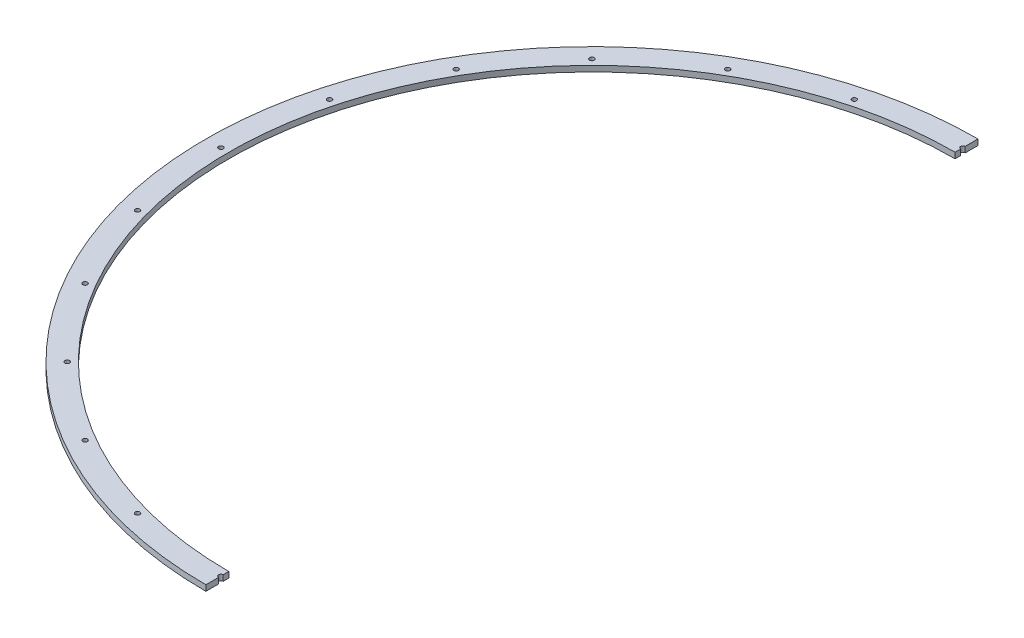
ISO-10303-21;
HEADER;
FILE_DESCRIPTION(('STEP AP214'),'2;1');
FILE_NAME('part.step','',(''),(''),'','','');
FILE_SCHEMA(('AUTOMOTIVE_DESIGN { 1 0 10303 214 1 1 1 1 }'));
ENDSEC;
DATA;
#1=APPLICATION_CONTEXT('core data for automotive mechanical design processes');
#2=APPLICATION_PROTOCOL_DEFINITION('international standard','automotive_design',2000,#1);
#3=PRODUCT_CONTEXT('',#1,'mechanical');
#4=PRODUCT('Part','Part','',(#3));
#5=PRODUCT_RELATED_PRODUCT_CATEGORY('part','',(#4));
#6=PRODUCT_DEFINITION_FORMATION('','',#4);
#7=PRODUCT_DEFINITION_CONTEXT('part definition',#1,'design');
#8=PRODUCT_DEFINITION('design','',#6,#7);
#9=PRODUCT_DEFINITION_SHAPE('','',#8);
#10=(LENGTH_UNIT() NAMED_UNIT(*) SI_UNIT(.MILLI.,.METRE.));
#11=(NAMED_UNIT(*) PLANE_ANGLE_UNIT() SI_UNIT($,.RADIAN.));
#12=(NAMED_UNIT(*) SI_UNIT($,.STERADIAN.) SOLID_ANGLE_UNIT());
#13=UNCERTAINTY_MEASURE_WITH_UNIT(LENGTH_MEASURE(1.E-05),#10,'distance_accuracy_value','');
#14=(GEOMETRIC_REPRESENTATION_CONTEXT(3) GLOBAL_UNCERTAINTY_ASSIGNED_CONTEXT((#13)) GLOBAL_UNIT_ASSIGNED_CONTEXT((#10,
#11,#12)) REPRESENTATION_CONTEXT('',''));
#15=CARTESIAN_POINT('',(0.,0.,0.));
#16=DIRECTION('',(0.,0.,1.));
#17=DIRECTION('',(1.,0.,0.));
#18=AXIS2_PLACEMENT_3D('',#15,#16,#17);
#19=CARTESIAN_POINT('',(0.,209.55,-401.955));
#20=DIRECTION('',(-1.,0.,0.));
#21=DIRECTION('',(0.,0.,1.));
#22=AXIS2_PLACEMENT_3D('',#19,#20,#21);
#23=PLANE('',#22);
#24=DIRECTION('',(0.,-1.,0.));
#25=VECTOR('',#24,1.);
#26=CARTESIAN_POINT('',(0.,209.55,-413.22625));
#27=LINE('',#26,#25);
#28=CARTESIAN_POINT('',(0.,203.2,-413.22625));
#29=VERTEX_POINT('',#28);
#30=CARTESIAN_POINT('',(0.,209.55,-413.22625));
#31=VERTEX_POINT('',#30);
#32=EDGE_CURVE('E100',#29,#31,#27,.F.);
#33=ORIENTED_EDGE('',*,*,#32,.F.);
#34=DIRECTION('',(0.,0.,-1.));
#35=VECTOR('',#34,1.);
#36=CARTESIAN_POINT('',(0.,203.2,-401.955));
#37=LINE('',#36,#35);
#38=CARTESIAN_POINT('',(0.,203.2,-427.355));
#39=VERTEX_POINT('',#38);
#40=EDGE_CURVE('E138',#29,#39,#37,.T.);
#41=ORIENTED_EDGE('',*,*,#40,.T.);
#42=DIRECTION('',(0.,-1.,0.));
#43=VECTOR('',#42,1.);
#44=CARTESIAN_POINT('',(0.,209.55,-427.355));
#45=LINE('',#44,#43);
#46=CARTESIAN_POINT('',(0.,209.55,-427.355));
#47=VERTEX_POINT('',#46);
#48=EDGE_CURVE('E120',#47,#39,#45,.T.);
#49=ORIENTED_EDGE('',*,*,#48,.F.);
#50=DIRECTION('',(0.,0.,-1.));
#51=VECTOR('',#50,1.);
#52=CARTESIAN_POINT('',(0.,209.55,-401.955));
#53=LINE('',#52,#51);
#54=EDGE_CURVE('E113',#31,#47,#53,.T.);
#55=ORIENTED_EDGE('',*,*,#54,.F.);
#56=EDGE_LOOP('',(#33,#41,#49,#55));
#57=FACE_BOUND('',#56,.T.);
#58=ADVANCED_FACE('F36',(#57),#23,.F.);
#59=DIRECTION('',(0.,-1.,0.));
#60=VECTOR('',#59,1.);
#61=CARTESIAN_POINT('',(0.,209.55,-408.14625));
#62=LINE('',#61,#60);
#63=CARTESIAN_POINT('',(0.,209.55,-408.14625));
#64=VERTEX_POINT('',#63);
#65=CARTESIAN_POINT('',(0.,203.2,-408.14625));
#66=VERTEX_POINT('',#65);
#67=EDGE_CURVE('E52',#64,#66,#62,.T.);
#68=ORIENTED_EDGE('',*,*,#67,.F.);
#69=CARTESIAN_POINT('',(0.,209.55,-401.955));
#70=VERTEX_POINT('',#69);
#71=EDGE_CURVE('E116',#70,#64,#53,.T.);
#72=ORIENTED_EDGE('',*,*,#71,.F.);
#73=DIRECTION('',(0.,-1.,0.));
#74=VECTOR('',#73,1.);
#75=CARTESIAN_POINT('',(0.,209.55,-401.955));
#76=LINE('',#75,#74);
#77=CARTESIAN_POINT('',(0.,203.2,-401.955));
#78=VERTEX_POINT('',#77);
#79=EDGE_CURVE('E144',#70,#78,#76,.T.);
#80=ORIENTED_EDGE('',*,*,#79,.T.);
#81=EDGE_CURVE('E139',#78,#66,#37,.T.);
#82=ORIENTED_EDGE('',*,*,#81,.T.);
#83=EDGE_LOOP('',(#68,#72,#80,#82));
#84=FACE_BOUND('',#83,.T.);
#85=ADVANCED_FACE('F213',(#84),#23,.F.);
#86=CARTESIAN_POINT('',(0.,209.55,427.355));
#87=DIRECTION('',(-1.,0.,0.));
#88=DIRECTION('',(0.,0.,1.));
#89=AXIS2_PLACEMENT_3D('',#86,#87,#88);
#90=PLANE('',#89);
#91=DIRECTION('',(0.,-1.,0.));
#92=VECTOR('',#91,1.);
#93=CARTESIAN_POINT('',(0.,209.55,408.14625));
#94=LINE('',#93,#92);
#95=CARTESIAN_POINT('',(0.,203.2,408.14625));
#96=VERTEX_POINT('',#95);
#97=CARTESIAN_POINT('',(0.,209.55,408.14625));
#98=VERTEX_POINT('',#97);
#99=EDGE_CURVE('E132',#96,#98,#94,.F.);
#100=ORIENTED_EDGE('',*,*,#99,.F.);
#101=DIRECTION('',(0.,0.,-1.));
#102=VECTOR('',#101,1.);
#103=CARTESIAN_POINT('',(0.,203.2,427.355));
#104=LINE('',#103,#102);
#105=CARTESIAN_POINT('',(0.,203.2,401.955));
#106=VERTEX_POINT('',#105);
#107=EDGE_CURVE('E131',#96,#106,#104,.T.);
#108=ORIENTED_EDGE('',*,*,#107,.T.);
#109=DIRECTION('',(0.,-1.,0.));
#110=VECTOR('',#109,1.);
#111=CARTESIAN_POINT('',(0.,209.55,401.955));
#112=LINE('',#111,#110);
#113=CARTESIAN_POINT('',(0.,209.55,401.955));
#114=VERTEX_POINT('',#113);
#115=EDGE_CURVE('E147',#114,#106,#112,.T.);
#116=ORIENTED_EDGE('',*,*,#115,.F.);
#117=DIRECTION('',(0.,0.,-1.));
#118=VECTOR('',#117,1.);
#119=CARTESIAN_POINT('',(0.,209.55,427.355));
#120=LINE('',#119,#118);
#121=EDGE_CURVE('E197',#98,#114,#120,.T.);
#122=ORIENTED_EDGE('',*,*,#121,.F.);
#123=EDGE_LOOP('',(#100,#108,#116,#122));
#124=FACE_BOUND('',#123,.T.);
#125=ADVANCED_FACE('F206',(#124),#90,.F.);
#126=DIRECTION('',(0.,-1.,0.));
#127=VECTOR('',#126,1.);
#128=CARTESIAN_POINT('',(0.,209.55,413.22625));
#129=LINE('',#128,#127);
#130=CARTESIAN_POINT('',(0.,209.55,413.22625));
#131=VERTEX_POINT('',#130);
#132=CARTESIAN_POINT('',(0.,203.2,413.22625));
#133=VERTEX_POINT('',#132);
#134=EDGE_CURVE('E60',#131,#133,#129,.T.);
#135=ORIENTED_EDGE('',*,*,#134,.F.);
#136=CARTESIAN_POINT('',(0.,209.55,427.355));
#137=VERTEX_POINT('',#136);
#138=EDGE_CURVE('E124',#137,#131,#120,.T.);
#139=ORIENTED_EDGE('',*,*,#138,.F.);
#140=DIRECTION('',(0.,-1.,0.));
#141=VECTOR('',#140,1.);
#142=CARTESIAN_POINT('',(0.,209.55,427.355));
#143=LINE('',#142,#141);
#144=CARTESIAN_POINT('',(0.,203.2,427.355));
#145=VERTEX_POINT('',#144);
#146=EDGE_CURVE('E150',#137,#145,#143,.T.);
#147=ORIENTED_EDGE('',*,*,#146,.T.);
#148=EDGE_CURVE('E133',#145,#133,#104,.T.);
#149=ORIENTED_EDGE('',*,*,#148,.T.);
#150=EDGE_LOOP('',(#135,#139,#147,#149));
#151=FACE_BOUND('',#150,.T.);
#152=ADVANCED_FACE('F301',(#151),#90,.F.);
#153=CARTESIAN_POINT('',(0.,209.55,0.));
#154=DIRECTION('',(0.,-1.,0.));
#155=DIRECTION('',(0.,0.,-1.));
#156=AXIS2_PLACEMENT_3D('',#153,#154,#155);
#157=CYLINDRICAL_SURFACE('',#156,427.355);
#158=CARTESIAN_POINT('',(0.,203.2,0.));
#159=DIRECTION('',(0.,1.,0.));
#160=DIRECTION('',(0.,0.,1.));
#161=AXIS2_PLACEMENT_3D('',#158,#159,#160);
#162=CIRCLE('',#161,427.355);
#163=EDGE_CURVE('E128',#39,#145,#162,.T.);
#164=ORIENTED_EDGE('',*,*,#163,.T.);
#165=ORIENTED_EDGE('',*,*,#146,.F.);
#166=CARTESIAN_POINT('',(0.,209.55,0.));
#167=DIRECTION('',(0.,1.,0.));
#168=DIRECTION('',(0.,0.,1.));
#169=AXIS2_PLACEMENT_3D('',#166,#167,#168);
#170=CIRCLE('',#169,427.355);
#171=EDGE_CURVE('E142',#47,#137,#170,.T.);
#172=ORIENTED_EDGE('',*,*,#171,.F.);
#173=ORIENTED_EDGE('',*,*,#48,.T.);
#174=EDGE_LOOP('',(#164,#165,#172,#173));
#175=FACE_BOUND('',#174,.T.);
#176=ADVANCED_FACE('F38',(#175),#157,.T.);
#177=CARTESIAN_POINT('',(0.,209.55,0.));
#178=DIRECTION('',(0.,-1.,0.));
#179=DIRECTION('',(0.,0.,-1.));
#180=AXIS2_PLACEMENT_3D('',#177,#178,#179);
#181=CYLINDRICAL_SURFACE('',#180,401.955);
#182=CARTESIAN_POINT('',(0.,203.2,0.));
#183=DIRECTION('',(0.,-1.,0.));
#184=DIRECTION('',(0.,0.,1.));
#185=AXIS2_PLACEMENT_3D('',#182,#183,#184);
#186=CIRCLE('',#185,401.955);
#187=EDGE_CURVE('E136',#106,#78,#186,.T.);
#188=ORIENTED_EDGE('',*,*,#187,.T.);
#189=ORIENTED_EDGE('',*,*,#79,.F.);
#190=CARTESIAN_POINT('',(0.,209.55,0.));
#191=DIRECTION('',(0.,-1.,0.));
#192=DIRECTION('',(0.,0.,1.));
#193=AXIS2_PLACEMENT_3D('',#190,#191,#192);
#194=CIRCLE('',#193,401.955);
#195=EDGE_CURVE('E122',#114,#70,#194,.T.);
#196=ORIENTED_EDGE('',*,*,#195,.F.);
#197=ORIENTED_EDGE('',*,*,#115,.T.);
#198=EDGE_LOOP('',(#188,#189,#196,#197));
#199=FACE_BOUND('',#198,.T.);
#200=ADVANCED_FACE('F210',(#199),#181,.F.);
#201=CARTESIAN_POINT('',(0.,209.55,0.));
#202=DIRECTION('',(0.,1.,0.));
#203=DIRECTION('',(0.,0.,1.));
#204=AXIS2_PLACEMENT_3D('',#201,#202,#203);
#205=PLANE('',#204);
#206=CARTESIAN_POINT('',(-205.343125,209.55,355.664725484967));
#207=DIRECTION('',(0.,1.,0.));
#208=DIRECTION('',(-0.500000000000001,0.,0.866025403784438));
#209=AXIS2_PLACEMENT_3D('',#206,#207,#208);
#210=CIRCLE('',#209,2.54000000000001);
#211=CARTESIAN_POINT('',(-206.613125,209.55,357.864430010579));
#212=VERTEX_POINT('',#211);
#213=EDGE_CURVE('E214',#212,#212,#210,.T.);
#214=ORIENTED_EDGE('',*,*,#213,.F.);
#215=EDGE_LOOP('',(#214));
#216=FACE_BOUND('',#215,.T.);
#217=CARTESIAN_POINT('',(-290.399032315074,209.55,290.399032315073));
#218=DIRECTION('',(0.,1.,0.));
#219=DIRECTION('',(-0.707106781186549,0.,0.707106781186546));
#220=AXIS2_PLACEMENT_3D('',#217,#218,#219);
#221=CIRCLE('',#220,2.54000000000001);
#222=CARTESIAN_POINT('',(-292.195083539288,209.55,292.195083539287));
#223=VERTEX_POINT('',#222);
#224=EDGE_CURVE('E216',#223,#223,#221,.T.);
#225=ORIENTED_EDGE('',*,*,#224,.F.);
#226=EDGE_LOOP('',(#225));
#227=FACE_BOUND('',#226,.T.);
#228=CARTESIAN_POINT('',(-355.664725484967,209.55,205.343124999999));
#229=DIRECTION('',(0.,1.,0.));
#230=DIRECTION('',(-0.86602540378444,0.,0.499999999999998));
#231=AXIS2_PLACEMENT_3D('',#228,#229,#230);
#232=CIRCLE('',#231,2.54000000000001);
#233=CARTESIAN_POINT('',(-357.86443001058,209.55,206.613124999999));
#234=VERTEX_POINT('',#233);
#235=EDGE_CURVE('E239',#234,#234,#232,.T.);
#236=ORIENTED_EDGE('',*,*,#235,.F.);
#237=EDGE_LOOP('',(#236));
#238=FACE_BOUND('',#237,.T.);
#239=CARTESIAN_POINT('',(-396.692455376809,209.55,106.293423061734));
#240=DIRECTION('',(0.,1.,0.));
#241=DIRECTION('',(-0.965925826289069,0.,0.258819045102518));
#242=AXIS2_PLACEMENT_3D('',#239,#240,#241);
#243=CIRCLE('',#242,2.54000000000001);
#244=CARTESIAN_POINT('',(-399.145906975583,209.55,106.950823436294));
#245=VERTEX_POINT('',#244);
#246=EDGE_CURVE('E236',#245,#245,#243,.T.);
#247=ORIENTED_EDGE('',*,*,#246,.F.);
#248=EDGE_LOOP('',(#247));
#249=FACE_BOUND('',#248,.T.);
#250=CARTESIAN_POINT('',(-410.68625,209.55,-1.32299483267052E-12));
#251=DIRECTION('',(0.,1.,0.));
#252=DIRECTION('',(-1.,0.,0.));
#253=AXIS2_PLACEMENT_3D('',#250,#251,#252);
#254=CIRCLE('',#253,2.54000000000001);
#255=CARTESIAN_POINT('',(-413.22625,209.55,-1.33186319527119E-12));
#256=VERTEX_POINT('',#255);
#257=EDGE_CURVE('E233',#256,#256,#254,.T.);
#258=ORIENTED_EDGE('',*,*,#257,.F.);
#259=EDGE_LOOP('',(#258));
#260=FACE_BOUND('',#259,.T.);
#261=CARTESIAN_POINT('',(-396.692455376808,209.55,-106.293423061737));
#262=DIRECTION('',(0.,1.,0.));
#263=DIRECTION('',(-0.965925826289067,0.,-0.258819045102525));
#264=AXIS2_PLACEMENT_3D('',#261,#262,#263);
#265=CIRCLE('',#264,2.54000000000001);
#266=CARTESIAN_POINT('',(-399.145906975583,209.55,-106.950823436297));
#267=VERTEX_POINT('',#266);
#268=EDGE_CURVE('E230',#267,#267,#265,.T.);
#269=ORIENTED_EDGE('',*,*,#268,.F.);
#270=EDGE_LOOP('',(#269));
#271=FACE_BOUND('',#270,.T.);
#272=CARTESIAN_POINT('',(-355.664725484966,209.55,-205.343125000002));
#273=DIRECTION('',(0.,1.,0.));
#274=DIRECTION('',(-0.866025403784436,0.,-0.500000000000004));
#275=AXIS2_PLACEMENT_3D('',#272,#273,#274);
#276=CIRCLE('',#275,2.54000000000001);
#277=CARTESIAN_POINT('',(-357.864430010578,209.55,-206.613125000002));
#278=VERTEX_POINT('',#277);
#279=EDGE_CURVE('E227',#278,#278,#276,.T.);
#280=ORIENTED_EDGE('',*,*,#279,.F.);
#281=EDGE_LOOP('',(#280));
#282=FACE_BOUND('',#281,.T.);
#283=CARTESIAN_POINT('',(-290.399032315072,209.55,-290.399032315075));
#284=DIRECTION('',(0.,1.,0.));
#285=DIRECTION('',(-0.707106781186544,0.,-0.707106781186551));
#286=AXIS2_PLACEMENT_3D('',#283,#284,#285);
#287=CIRCLE('',#286,2.54000000000001);
#288=CARTESIAN_POINT('',(-292.195083539286,209.55,-292.195083539289));
#289=VERTEX_POINT('',#288);
#290=EDGE_CURVE('E224',#289,#289,#287,.T.);
#291=ORIENTED_EDGE('',*,*,#290,.F.);
#292=EDGE_LOOP('',(#291));
#293=FACE_BOUND('',#292,.T.);
#294=CARTESIAN_POINT('',(-205.343124999998,209.55,-355.664725484968));
#295=DIRECTION('',(0.,1.,0.));
#296=DIRECTION('',(-0.499999999999995,0.,-0.866025403784442));
#297=AXIS2_PLACEMENT_3D('',#294,#295,#296);
#298=CIRCLE('',#297,2.54000000000001);
#299=CARTESIAN_POINT('',(-206.613124999998,209.55,-357.86443001058));
#300=VERTEX_POINT('',#299);
#301=EDGE_CURVE('E221',#300,#300,#298,.T.);
#302=ORIENTED_EDGE('',*,*,#301,.F.);
#303=EDGE_LOOP('',(#302));
#304=FACE_BOUND('',#303,.T.);
#305=CARTESIAN_POINT('',(-106.293423061733,209.55,-396.692455376809));
#306=DIRECTION('',(0.,1.,0.));
#307=DIRECTION('',(-0.258819045102515,0.,-0.96592582628907));
#308=AXIS2_PLACEMENT_3D('',#305,#306,#307);
#309=CIRCLE('',#308,2.54000000000001);
#310=CARTESIAN_POINT('',(-106.950823436293,209.55,-399.145906975584));
#311=VERTEX_POINT('',#310);
#312=EDGE_CURVE('E117',#311,#311,#309,.T.);
#313=ORIENTED_EDGE('',*,*,#312,.F.);
#314=EDGE_LOOP('',(#313));
#315=FACE_BOUND('',#314,.T.);
#316=CARTESIAN_POINT('',(-106.293423061735,209.55,396.692455376809));
#317=DIRECTION('',(0.,1.,0.));
#318=DIRECTION('',(-0.258819045102521,0.,0.965925826289068));
#319=AXIS2_PLACEMENT_3D('',#316,#317,#318);
#320=CIRCLE('',#319,2.54000000000001);
#321=CARTESIAN_POINT('',(-106.950823436296,209.55,399.145906975583));
#322=VERTEX_POINT('',#321);
#323=EDGE_CURVE('E157',#322,#322,#320,.T.);
#324=ORIENTED_EDGE('',*,*,#323,.F.);
#325=EDGE_LOOP('',(#324));
#326=FACE_BOUND('',#325,.T.);
#327=ORIENTED_EDGE('',*,*,#71,.T.);
#328=CARTESIAN_POINT('',(-1.10908545323941E-13,209.55,-410.68625));
#329=DIRECTION('',(0.,1.,0.));
#330=DIRECTION('',(0.,0.,-1.));
#331=AXIS2_PLACEMENT_3D('',#328,#329,#330);
#332=CIRCLE('',#331,2.54000000000001);
#333=EDGE_CURVE('E103',#31,#64,#332,.T.);
#334=ORIENTED_EDGE('',*,*,#333,.F.);
#335=ORIENTED_EDGE('',*,*,#54,.T.);
#336=ORIENTED_EDGE('',*,*,#171,.T.);
#337=ORIENTED_EDGE('',*,*,#138,.T.);
#338=CARTESIAN_POINT('',(1.10908545323941E-13,209.55,410.68625));
#339=DIRECTION('',(0.,1.,0.));
#340=DIRECTION('',(0.,0.,1.));
#341=AXIS2_PLACEMENT_3D('',#338,#339,#340);
#342=CIRCLE('',#341,2.54000000000001);
#343=EDGE_CURVE('E156',#98,#131,#342,.T.);
#344=ORIENTED_EDGE('',*,*,#343,.F.);
#345=ORIENTED_EDGE('',*,*,#121,.T.);
#346=ORIENTED_EDGE('',*,*,#195,.T.);
#347=EDGE_LOOP('',(#327,#334,#335,#336,#337,#344,#345,#346));
#348=FACE_BOUND('',#347,.T.);
#349=ADVANCED_FACE('F111',(#216,#227,#238,#249,#260,#271,#282,#293,#304,#315,#326,#348),#205,.T.);
#350=CARTESIAN_POINT('',(0.,203.2,0.));
#351=DIRECTION('',(0.,1.,0.));
#352=DIRECTION('',(0.,0.,1.));
#353=AXIS2_PLACEMENT_3D('',#350,#351,#352);
#354=PLANE('',#353);
#355=CARTESIAN_POINT('',(-205.343125,203.2,355.664725484967));
#356=DIRECTION('',(0.,1.,0.));
#357=DIRECTION('',(0.,0.,1.));
#358=AXIS2_PLACEMENT_3D('',#355,#356,#357);
#359=CIRCLE('',#358,2.54000000000001);
#360=CARTESIAN_POINT('',(-205.343125,203.2,358.204725484967));
#361=VERTEX_POINT('',#360);
#362=EDGE_CURVE('E40',#361,#361,#359,.F.);
#363=ORIENTED_EDGE('',*,*,#362,.F.);
#364=EDGE_LOOP('',(#363));
#365=FACE_BOUND('',#364,.T.);
#366=CARTESIAN_POINT('',(-290.399032315074,203.2,290.399032315073));
#367=DIRECTION('',(0.,1.,0.));
#368=DIRECTION('',(0.,0.,1.));
#369=AXIS2_PLACEMENT_3D('',#366,#367,#368);
#370=CIRCLE('',#369,2.54000000000001);
#371=CARTESIAN_POINT('',(-290.399032315074,203.2,292.939032315073));
#372=VERTEX_POINT('',#371);
#373=EDGE_CURVE('E181',#372,#372,#370,.F.);
#374=ORIENTED_EDGE('',*,*,#373,.F.);
#375=EDGE_LOOP('',(#374));
#376=FACE_BOUND('',#375,.T.);
#377=CARTESIAN_POINT('',(-355.664725484967,203.2,205.343124999999));
#378=DIRECTION('',(0.,1.,0.));
#379=DIRECTION('',(0.,0.,1.));
#380=AXIS2_PLACEMENT_3D('',#377,#378,#379);
#381=CIRCLE('',#380,2.54000000000001);
#382=CARTESIAN_POINT('',(-355.664725484967,203.2,207.883124999999));
#383=VERTEX_POINT('',#382);
#384=EDGE_CURVE('E179',#383,#383,#381,.F.);
#385=ORIENTED_EDGE('',*,*,#384,.F.);
#386=EDGE_LOOP('',(#385));
#387=FACE_BOUND('',#386,.T.);
#388=CARTESIAN_POINT('',(-396.692455376809,203.2,106.293423061734));
#389=DIRECTION('',(0.,1.,0.));
#390=DIRECTION('',(0.,0.,1.));
#391=AXIS2_PLACEMENT_3D('',#388,#389,#390);
#392=CIRCLE('',#391,2.54000000000001);
#393=CARTESIAN_POINT('',(-396.692455376809,203.2,108.833423061734));
#394=VERTEX_POINT('',#393);
#395=EDGE_CURVE('E176',#394,#394,#392,.F.);
#396=ORIENTED_EDGE('',*,*,#395,.F.);
#397=EDGE_LOOP('',(#396));
#398=FACE_BOUND('',#397,.T.);
#399=CARTESIAN_POINT('',(-410.68625,203.2,-1.32299483267052E-12));
#400=DIRECTION('',(0.,1.,0.));
#401=DIRECTION('',(0.,0.,1.));
#402=AXIS2_PLACEMENT_3D('',#399,#400,#401);
#403=CIRCLE('',#402,2.54000000000001);
#404=CARTESIAN_POINT('',(-410.68625,203.2,2.53999999999868));
#405=VERTEX_POINT('',#404);
#406=EDGE_CURVE('E173',#405,#405,#403,.F.);
#407=ORIENTED_EDGE('',*,*,#406,.F.);
#408=EDGE_LOOP('',(#407));
#409=FACE_BOUND('',#408,.T.);
#410=CARTESIAN_POINT('',(-396.692455376808,203.2,-106.293423061737));
#411=DIRECTION('',(0.,1.,0.));
#412=DIRECTION('',(0.,0.,1.));
#413=AXIS2_PLACEMENT_3D('',#410,#411,#412);
#414=CIRCLE('',#413,2.54000000000001);
#415=CARTESIAN_POINT('',(-396.692455376808,203.2,-103.753423061737));
#416=VERTEX_POINT('',#415);
#417=EDGE_CURVE('E170',#416,#416,#414,.F.);
#418=ORIENTED_EDGE('',*,*,#417,.F.);
#419=EDGE_LOOP('',(#418));
#420=FACE_BOUND('',#419,.T.);
#421=CARTESIAN_POINT('',(-355.664725484966,203.2,-205.343125000002));
#422=DIRECTION('',(0.,1.,0.));
#423=DIRECTION('',(0.,0.,1.));
#424=AXIS2_PLACEMENT_3D('',#421,#422,#423);
#425=CIRCLE('',#424,2.54000000000001);
#426=CARTESIAN_POINT('',(-355.664725484966,203.2,-202.803125000002));
#427=VERTEX_POINT('',#426);
#428=EDGE_CURVE('E167',#427,#427,#425,.F.);
#429=ORIENTED_EDGE('',*,*,#428,.F.);
#430=EDGE_LOOP('',(#429));
#431=FACE_BOUND('',#430,.T.);
#432=CARTESIAN_POINT('',(-290.399032315072,203.2,-290.399032315075));
#433=DIRECTION('',(0.,1.,0.));
#434=DIRECTION('',(0.,0.,1.));
#435=AXIS2_PLACEMENT_3D('',#432,#433,#434);
#436=CIRCLE('',#435,2.54000000000001);
#437=CARTESIAN_POINT('',(-290.399032315072,203.2,-287.859032315075));
#438=VERTEX_POINT('',#437);
#439=EDGE_CURVE('E164',#438,#438,#436,.F.);
#440=ORIENTED_EDGE('',*,*,#439,.F.);
#441=EDGE_LOOP('',(#440));
#442=FACE_BOUND('',#441,.T.);
#443=CARTESIAN_POINT('',(-205.343124999998,203.2,-355.664725484968));
#444=DIRECTION('',(0.,1.,0.));
#445=DIRECTION('',(0.,0.,1.));
#446=AXIS2_PLACEMENT_3D('',#443,#444,#445);
#447=CIRCLE('',#446,2.54000000000001);
#448=CARTESIAN_POINT('',(-205.343124999998,203.2,-353.124725484968));
#449=VERTEX_POINT('',#448);
#450=EDGE_CURVE('E161',#449,#449,#447,.F.);
#451=ORIENTED_EDGE('',*,*,#450,.F.);
#452=EDGE_LOOP('',(#451));
#453=FACE_BOUND('',#452,.T.);
#454=CARTESIAN_POINT('',(-106.293423061733,203.2,-396.692455376809));
#455=DIRECTION('',(0.,1.,0.));
#456=DIRECTION('',(0.,0.,1.));
#457=AXIS2_PLACEMENT_3D('',#454,#455,#456);
#458=CIRCLE('',#457,2.54000000000001);
#459=CARTESIAN_POINT('',(-106.293423061733,203.2,-394.152455376809));
#460=VERTEX_POINT('',#459);
#461=EDGE_CURVE('E107',#460,#460,#458,.F.);
#462=ORIENTED_EDGE('',*,*,#461,.F.);
#463=EDGE_LOOP('',(#462));
#464=FACE_BOUND('',#463,.T.);
#465=CARTESIAN_POINT('',(-1.10908545323941E-13,203.2,-410.68625));
#466=DIRECTION('',(0.,1.,0.));
#467=DIRECTION('',(0.,0.,1.));
#468=AXIS2_PLACEMENT_3D('',#465,#466,#467);
#469=CIRCLE('',#468,2.54000000000001);
#470=EDGE_CURVE('E12',#66,#29,#469,.F.);
#471=ORIENTED_EDGE('',*,*,#470,.F.);
#472=ORIENTED_EDGE('',*,*,#81,.F.);
#473=ORIENTED_EDGE('',*,*,#187,.F.);
#474=ORIENTED_EDGE('',*,*,#107,.F.);
#475=CARTESIAN_POINT('',(1.10908545323941E-13,203.2,410.68625));
#476=DIRECTION('',(0.,1.,0.));
#477=DIRECTION('',(0.,0.,1.));
#478=AXIS2_PLACEMENT_3D('',#475,#476,#477);
#479=CIRCLE('',#478,2.54000000000001);
#480=EDGE_CURVE('E45',#133,#96,#479,.F.);
#481=ORIENTED_EDGE('',*,*,#480,.F.);
#482=ORIENTED_EDGE('',*,*,#148,.F.);
#483=ORIENTED_EDGE('',*,*,#163,.F.);
#484=ORIENTED_EDGE('',*,*,#40,.F.);
#485=EDGE_LOOP('',(#471,#472,#473,#474,#481,#482,#483,#484));
#486=FACE_BOUND('',#485,.T.);
#487=CARTESIAN_POINT('',(-106.293423061735,203.2,396.692455376809));
#488=DIRECTION('',(0.,1.,0.));
#489=DIRECTION('',(0.,0.,1.));
#490=AXIS2_PLACEMENT_3D('',#487,#488,#489);
#491=CIRCLE('',#490,2.54000000000001);
#492=CARTESIAN_POINT('',(-106.293423061735,203.2,399.232455376809));
#493=VERTEX_POINT('',#492);
#494=EDGE_CURVE('E154',#493,#493,#491,.F.);
#495=ORIENTED_EDGE('',*,*,#494,.F.);
#496=EDGE_LOOP('',(#495));
#497=FACE_BOUND('',#496,.T.);
#498=ADVANCED_FACE('F249',(#365,#376,#387,#398,#409,#420,#431,#442,#453,#464,#486,#497),#354,.F.);
#499=CARTESIAN_POINT('',(1.10908545323941E-13,209.55,410.68625));
#500=DIRECTION('',(0.,-1.,0.));
#501=DIRECTION('',(0.,0.,-1.));
#502=AXIS2_PLACEMENT_3D('',#499,#500,#501);
#503=CYLINDRICAL_SURFACE('',#502,2.54000000000001);
#504=ORIENTED_EDGE('',*,*,#99,.T.);
#505=ORIENTED_EDGE('',*,*,#343,.T.);
#506=ORIENTED_EDGE('',*,*,#134,.T.);
#507=ORIENTED_EDGE('',*,*,#480,.T.);
#508=EDGE_LOOP('',(#504,#505,#506,#507));
#509=FACE_BOUND('',#508,.T.);
#510=ADVANCED_FACE('F278',(#509),#503,.F.);
#511=CARTESIAN_POINT('',(-106.293423061735,209.55,396.692455376809));
#512=DIRECTION('',(0.,-1.,0.));
#513=DIRECTION('',(0.,0.,-1.));
#514=AXIS2_PLACEMENT_3D('',#511,#512,#513);
#515=CYLINDRICAL_SURFACE('',#514,2.54000000000001);
#516=ORIENTED_EDGE('',*,*,#323,.T.);
#517=EDGE_LOOP('',(#516));
#518=FACE_BOUND('',#517,.T.);
#519=ORIENTED_EDGE('',*,*,#494,.T.);
#520=EDGE_LOOP('',(#519));
#521=FACE_BOUND('',#520,.T.);
#522=ADVANCED_FACE('F284',(#518,#521),#515,.F.);
#523=CARTESIAN_POINT('',(-1.10908545323941E-13,209.55,-410.68625));
#524=DIRECTION('',(0.,-1.,0.));
#525=DIRECTION('',(0.,0.,-1.));
#526=AXIS2_PLACEMENT_3D('',#523,#524,#525);
#527=CYLINDRICAL_SURFACE('',#526,2.54000000000001);
#528=ORIENTED_EDGE('',*,*,#32,.T.);
#529=ORIENTED_EDGE('',*,*,#333,.T.);
#530=ORIENTED_EDGE('',*,*,#67,.T.);
#531=ORIENTED_EDGE('',*,*,#470,.T.);
#532=EDGE_LOOP('',(#528,#529,#530,#531));
#533=FACE_BOUND('',#532,.T.);
#534=ADVANCED_FACE('F102',(#533),#527,.F.);
#535=CARTESIAN_POINT('',(-106.293423061733,209.55,-396.692455376809));
#536=DIRECTION('',(0.,-1.,0.));
#537=DIRECTION('',(0.,0.,-1.));
#538=AXIS2_PLACEMENT_3D('',#535,#536,#537);
#539=CYLINDRICAL_SURFACE('',#538,2.54000000000001);
#540=ORIENTED_EDGE('',*,*,#312,.T.);
#541=EDGE_LOOP('',(#540));
#542=FACE_BOUND('',#541,.T.);
#543=ORIENTED_EDGE('',*,*,#461,.T.);
#544=EDGE_LOOP('',(#543));
#545=FACE_BOUND('',#544,.T.);
#546=ADVANCED_FACE('F269',(#542,#545),#539,.F.);
#547=CARTESIAN_POINT('',(-205.343124999998,209.55,-355.664725484968));
#548=DIRECTION('',(0.,-1.,0.));
#549=DIRECTION('',(0.,0.,-1.));
#550=AXIS2_PLACEMENT_3D('',#547,#548,#549);
#551=CYLINDRICAL_SURFACE('',#550,2.54000000000001);
#552=ORIENTED_EDGE('',*,*,#301,.T.);
#553=EDGE_LOOP('',(#552));
#554=FACE_BOUND('',#553,.T.);
#555=ORIENTED_EDGE('',*,*,#450,.T.);
#556=EDGE_LOOP('',(#555));
#557=FACE_BOUND('',#556,.T.);
#558=ADVANCED_FACE('F272',(#554,#557),#551,.F.);
#559=CARTESIAN_POINT('',(-290.399032315072,209.55,-290.399032315075));
#560=DIRECTION('',(0.,-1.,0.));
#561=DIRECTION('',(0.,0.,-1.));
#562=AXIS2_PLACEMENT_3D('',#559,#560,#561);
#563=CYLINDRICAL_SURFACE('',#562,2.54000000000001);
#564=ORIENTED_EDGE('',*,*,#290,.T.);
#565=EDGE_LOOP('',(#564));
#566=FACE_BOUND('',#565,.T.);
#567=ORIENTED_EDGE('',*,*,#439,.T.);
#568=EDGE_LOOP('',(#567));
#569=FACE_BOUND('',#568,.T.);
#570=ADVANCED_FACE('F367',(#566,#569),#563,.F.);
#571=CARTESIAN_POINT('',(-355.664725484966,209.55,-205.343125000002));
#572=DIRECTION('',(0.,-1.,0.));
#573=DIRECTION('',(0.,0.,-1.));
#574=AXIS2_PLACEMENT_3D('',#571,#572,#573);
#575=CYLINDRICAL_SURFACE('',#574,2.54000000000001);
#576=ORIENTED_EDGE('',*,*,#279,.T.);
#577=EDGE_LOOP('',(#576));
#578=FACE_BOUND('',#577,.T.);
#579=ORIENTED_EDGE('',*,*,#428,.T.);
#580=EDGE_LOOP('',(#579));
#581=FACE_BOUND('',#580,.T.);
#582=ADVANCED_FACE('F376',(#578,#581),#575,.F.);
#583=CARTESIAN_POINT('',(-396.692455376808,209.55,-106.293423061737));
#584=DIRECTION('',(0.,-1.,0.));
#585=DIRECTION('',(0.,0.,-1.));
#586=AXIS2_PLACEMENT_3D('',#583,#584,#585);
#587=CYLINDRICAL_SURFACE('',#586,2.54000000000001);
#588=ORIENTED_EDGE('',*,*,#268,.T.);
#589=EDGE_LOOP('',(#588));
#590=FACE_BOUND('',#589,.T.);
#591=ORIENTED_EDGE('',*,*,#417,.T.);
#592=EDGE_LOOP('',(#591));
#593=FACE_BOUND('',#592,.T.);
#594=ADVANCED_FACE('F385',(#590,#593),#587,.F.);
#595=CARTESIAN_POINT('',(-410.68625,209.55,-1.32299483267052E-12));
#596=DIRECTION('',(0.,-1.,0.));
#597=DIRECTION('',(0.,0.,-1.));
#598=AXIS2_PLACEMENT_3D('',#595,#596,#597);
#599=CYLINDRICAL_SURFACE('',#598,2.54000000000001);
#600=ORIENTED_EDGE('',*,*,#257,.T.);
#601=EDGE_LOOP('',(#600));
#602=FACE_BOUND('',#601,.T.);
#603=ORIENTED_EDGE('',*,*,#406,.T.);
#604=EDGE_LOOP('',(#603));
#605=FACE_BOUND('',#604,.T.);
#606=ADVANCED_FACE('F394',(#602,#605),#599,.F.);
#607=CARTESIAN_POINT('',(-396.692455376809,209.55,106.293423061734));
#608=DIRECTION('',(0.,-1.,0.));
#609=DIRECTION('',(0.,0.,-1.));
#610=AXIS2_PLACEMENT_3D('',#607,#608,#609);
#611=CYLINDRICAL_SURFACE('',#610,2.54000000000001);
#612=ORIENTED_EDGE('',*,*,#246,.T.);
#613=EDGE_LOOP('',(#612));
#614=FACE_BOUND('',#613,.T.);
#615=ORIENTED_EDGE('',*,*,#395,.T.);
#616=EDGE_LOOP('',(#615));
#617=FACE_BOUND('',#616,.T.);
#618=ADVANCED_FACE('F403',(#614,#617),#611,.F.);
#619=CARTESIAN_POINT('',(-355.664725484967,209.55,205.343124999999));
#620=DIRECTION('',(0.,-1.,0.));
#621=DIRECTION('',(0.,0.,-1.));
#622=AXIS2_PLACEMENT_3D('',#619,#620,#621);
#623=CYLINDRICAL_SURFACE('',#622,2.54000000000001);
#624=ORIENTED_EDGE('',*,*,#235,.T.);
#625=EDGE_LOOP('',(#624));
#626=FACE_BOUND('',#625,.T.);
#627=ORIENTED_EDGE('',*,*,#384,.T.);
#628=EDGE_LOOP('',(#627));
#629=FACE_BOUND('',#628,.T.);
#630=ADVANCED_FACE('F412',(#626,#629),#623,.F.);
#631=CARTESIAN_POINT('',(-290.399032315074,209.55,290.399032315073));
#632=DIRECTION('',(0.,-1.,0.));
#633=DIRECTION('',(0.,0.,-1.));
#634=AXIS2_PLACEMENT_3D('',#631,#632,#633);
#635=CYLINDRICAL_SURFACE('',#634,2.54000000000001);
#636=ORIENTED_EDGE('',*,*,#224,.T.);
#637=EDGE_LOOP('',(#636));
#638=FACE_BOUND('',#637,.T.);
#639=ORIENTED_EDGE('',*,*,#373,.T.);
#640=EDGE_LOOP('',(#639));
#641=FACE_BOUND('',#640,.T.);
#642=ADVANCED_FACE('F245',(#638,#641),#635,.F.);
#643=CARTESIAN_POINT('',(-205.343125,209.55,355.664725484967));
#644=DIRECTION('',(0.,-1.,0.));
#645=DIRECTION('',(0.,0.,-1.));
#646=AXIS2_PLACEMENT_3D('',#643,#644,#645);
#647=CYLINDRICAL_SURFACE('',#646,2.54000000000001);
#648=ORIENTED_EDGE('',*,*,#213,.T.);
#649=EDGE_LOOP('',(#648));
#650=FACE_BOUND('',#649,.T.);
#651=ORIENTED_EDGE('',*,*,#362,.T.);
#652=EDGE_LOOP('',(#651));
#653=FACE_BOUND('',#652,.T.);
#654=ADVANCED_FACE('F429',(#650,#653),#647,.F.);
#655=CLOSED_SHELL('',(#58,#85,#125,#152,#176,#200,#349,#498,#510,#522,#534,#546,#558,#570,#582,
#594,#606,#618,#630,#642,#654));
#656=MANIFOLD_SOLID_BREP('B2',#655);
#657=ADVANCED_BREP_SHAPE_REPRESENTATION('',(#18,#656),#14);
#658=SHAPE_DEFINITION_REPRESENTATION(#9,#657);
ENDSEC;
END-ISO-10303-21;
